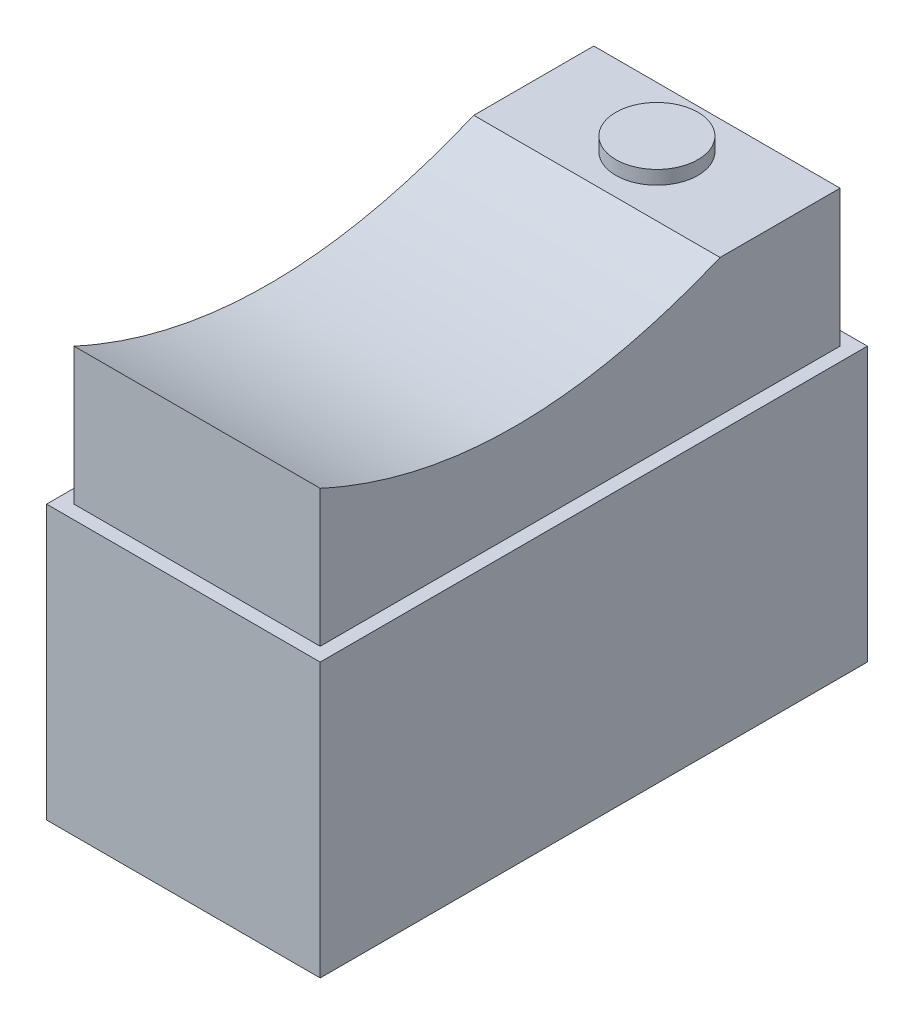
ISO-10303-21;
HEADER;
FILE_DESCRIPTION(('STEP AP214'),'2;1');
FILE_NAME('part.step','',(''),(''),'','','');
FILE_SCHEMA(('AUTOMOTIVE_DESIGN { 1 0 10303 214 1 1 1 1 }'));
ENDSEC;
DATA;
#1=APPLICATION_CONTEXT('core data for automotive mechanical design processes');
#2=APPLICATION_PROTOCOL_DEFINITION('international standard','automotive_design',2000,#1);
#3=PRODUCT_CONTEXT('',#1,'mechanical');
#4=PRODUCT('Part','Part','',(#3));
#5=PRODUCT_RELATED_PRODUCT_CATEGORY('part','',(#4));
#6=PRODUCT_DEFINITION_FORMATION('','',#4);
#7=PRODUCT_DEFINITION_CONTEXT('part definition',#1,'design');
#8=PRODUCT_DEFINITION('design','',#6,#7);
#9=PRODUCT_DEFINITION_SHAPE('','',#8);
#10=(LENGTH_UNIT() NAMED_UNIT(*) SI_UNIT(.MILLI.,.METRE.));
#11=(NAMED_UNIT(*) PLANE_ANGLE_UNIT() SI_UNIT($,.RADIAN.));
#12=(NAMED_UNIT(*) SI_UNIT($,.STERADIAN.) SOLID_ANGLE_UNIT());
#13=UNCERTAINTY_MEASURE_WITH_UNIT(LENGTH_MEASURE(1.E-05),#10,'distance_accuracy_value','');
#14=(GEOMETRIC_REPRESENTATION_CONTEXT(3) GLOBAL_UNCERTAINTY_ASSIGNED_CONTEXT((#13)) GLOBAL_UNIT_ASSIGNED_CONTEXT((#10,
#11,#12)) REPRESENTATION_CONTEXT('',''));
#15=CARTESIAN_POINT('',(0.,0.,0.));
#16=DIRECTION('',(0.,0.,1.));
#17=DIRECTION('',(1.,0.,0.));
#18=AXIS2_PLACEMENT_3D('',#15,#16,#17);
#19=CARTESIAN_POINT('',(0.,30.,0.));
#20=DIRECTION('',(0.,-1.,0.));
#21=DIRECTION('',(0.,0.,-1.));
#22=AXIS2_PLACEMENT_3D('',#19,#20,#21);
#23=PLANE('',#22);
#24=DIRECTION('',(1.,0.,0.));
#25=VECTOR('',#24,1.);
#26=CARTESIAN_POINT('',(-100.064560089181,30.,-10.2263908022718));
#27=LINE('',#26,#25);
#28=CARTESIAN_POINT('',(9.,30.,-10.2263908022718));
#29=VERTEX_POINT('',#28);
#30=CARTESIAN_POINT('',(-9.,30.,-10.2263908022718));
#31=VERTEX_POINT('',#30);
#32=EDGE_CURVE('E41',#29,#31,#27,.F.);
#33=ORIENTED_EDGE('',*,*,#32,.F.);
#34=DIRECTION('',(0.,0.,-1.));
#35=VECTOR('',#34,1.);
#36=CARTESIAN_POINT('',(9.,30.,19.));
#37=LINE('',#36,#35);
#38=CARTESIAN_POINT('',(9.,30.,-19.));
#39=VERTEX_POINT('',#38);
#40=EDGE_CURVE('E120',#29,#39,#37,.T.);
#41=ORIENTED_EDGE('',*,*,#40,.T.);
#42=DIRECTION('',(-1.,0.,0.));
#43=VECTOR('',#42,1.);
#44=CARTESIAN_POINT('',(-9.,30.,-19.));
#45=LINE('',#44,#43);
#46=CARTESIAN_POINT('',(-9.,30.,-19.));
#47=VERTEX_POINT('',#46);
#48=EDGE_CURVE('E129',#39,#47,#45,.T.);
#49=ORIENTED_EDGE('',*,*,#48,.T.);
#50=DIRECTION('',(0.,0.,1.));
#51=VECTOR('',#50,1.);
#52=CARTESIAN_POINT('',(-9.,30.,19.));
#53=LINE('',#52,#51);
#54=EDGE_CURVE('E125',#47,#31,#53,.T.);
#55=ORIENTED_EDGE('',*,*,#54,.T.);
#56=EDGE_LOOP('',(#33,#41,#49,#55));
#57=FACE_BOUND('',#56,.T.);
#58=CARTESIAN_POINT('',(0.,30.,-14.6131954011359));
#59=DIRECTION('',(0.,-1.,0.));
#60=DIRECTION('',(0.,0.,-1.));
#61=AXIS2_PLACEMENT_3D('',#58,#59,#60);
#62=CIRCLE('',#61,3.);
#63=CARTESIAN_POINT('',(0.,30.,-17.6131954011359));
#64=VERTEX_POINT('',#63);
#65=EDGE_CURVE('E11',#64,#64,#62,.F.);
#66=ORIENTED_EDGE('',*,*,#65,.F.);
#67=EDGE_LOOP('',(#66));
#68=FACE_BOUND('',#67,.T.);
#69=ADVANCED_FACE('F33',(#57,#68),#23,.F.);
#70=CARTESIAN_POINT('',(9.,20.,19.));
#71=DIRECTION('',(1.,0.,0.));
#72=DIRECTION('',(0.,0.,-1.));
#73=AXIS2_PLACEMENT_3D('',#70,#71,#72);
#74=PLANE('',#73);
#75=ORIENTED_EDGE('',*,*,#40,.F.);
#76=CARTESIAN_POINT('',(8.99999999999999,30.,-10.2263908022718));
#77=CARTESIAN_POINT('',(8.99999999999999,23.5924007474875,5.11136514016385));
#78=CARTESIAN_POINT('',(8.99999999999999,30.,19.));
#79=B_SPLINE_CURVE_WITH_KNOTS('',2,(#76,#77,#78),.UNSPECIFIED.,.F.,.F.,(3,3),(0.,1.),.UNSPECIFIED.);
#80=CARTESIAN_POINT('',(8.99999999999999,30.,19.));
#81=VERTEX_POINT('',#80);
#82=EDGE_CURVE('E117',#29,#81,#79,.T.);
#83=ORIENTED_EDGE('',*,*,#82,.T.);
#84=DIRECTION('',(0.,1.,0.));
#85=VECTOR('',#84,1.);
#86=CARTESIAN_POINT('',(9.,20.,19.));
#87=LINE('',#86,#85);
#88=CARTESIAN_POINT('',(9.,20.,19.));
#89=VERTEX_POINT('',#88);
#90=EDGE_CURVE('E103',#89,#81,#87,.T.);
#91=ORIENTED_EDGE('',*,*,#90,.F.);
#92=DIRECTION('',(0.,0.,-1.));
#93=VECTOR('',#92,1.);
#94=CARTESIAN_POINT('',(9.,20.,19.));
#95=LINE('',#94,#93);
#96=CARTESIAN_POINT('',(9.,20.,-19.));
#97=VERTEX_POINT('',#96);
#98=EDGE_CURVE('E124',#89,#97,#95,.T.);
#99=ORIENTED_EDGE('',*,*,#98,.T.);
#100=DIRECTION('',(0.,1.,0.));
#101=VECTOR('',#100,1.);
#102=CARTESIAN_POINT('',(9.,20.,-19.));
#103=LINE('',#102,#101);
#104=EDGE_CURVE('E137',#97,#39,#103,.T.);
#105=ORIENTED_EDGE('',*,*,#104,.T.);
#106=EDGE_LOOP('',(#75,#83,#91,#99,#105));
#107=FACE_BOUND('',#106,.T.);
#108=ADVANCED_FACE('F118',(#107),#74,.T.);
#109=CARTESIAN_POINT('',(-9.,20.,19.));
#110=DIRECTION('',(-1.,0.,0.));
#111=DIRECTION('',(0.,0.,1.));
#112=AXIS2_PLACEMENT_3D('',#109,#110,#111);
#113=PLANE('',#112);
#114=DIRECTION('',(0.,1.,0.));
#115=VECTOR('',#114,1.);
#116=CARTESIAN_POINT('',(-9.,20.,19.));
#117=LINE('',#116,#115);
#118=CARTESIAN_POINT('',(-9.,20.,19.));
#119=VERTEX_POINT('',#118);
#120=CARTESIAN_POINT('',(-9.,30.,19.));
#121=VERTEX_POINT('',#120);
#122=EDGE_CURVE('E114',#119,#121,#117,.T.);
#123=ORIENTED_EDGE('',*,*,#122,.T.);
#124=CARTESIAN_POINT('',(-9.00000000000001,30.,-10.2263908022718));
#125=CARTESIAN_POINT('',(-9.00000000000001,23.5924007474875,5.11136514016385));
#126=CARTESIAN_POINT('',(-9.00000000000001,30.,19.));
#127=B_SPLINE_CURVE_WITH_KNOTS('',2,(#124,#125,#126),.UNSPECIFIED.,.F.,.F.,(3,3),(0.,1.),.UNSPECIFIED.);
#128=EDGE_CURVE('E48',#121,#31,#127,.F.);
#129=ORIENTED_EDGE('',*,*,#128,.T.);
#130=ORIENTED_EDGE('',*,*,#54,.F.);
#131=DIRECTION('',(0.,1.,0.));
#132=VECTOR('',#131,1.);
#133=CARTESIAN_POINT('',(-9.,20.,-19.));
#134=LINE('',#133,#132);
#135=CARTESIAN_POINT('',(-9.,20.,-19.));
#136=VERTEX_POINT('',#135);
#137=EDGE_CURVE('E134',#136,#47,#134,.T.);
#138=ORIENTED_EDGE('',*,*,#137,.F.);
#139=DIRECTION('',(0.,0.,1.));
#140=VECTOR('',#139,1.);
#141=CARTESIAN_POINT('',(-9.,20.,19.));
#142=LINE('',#141,#140);
#143=EDGE_CURVE('E236',#136,#119,#142,.T.);
#144=ORIENTED_EDGE('',*,*,#143,.T.);
#145=EDGE_LOOP('',(#123,#129,#130,#138,#144));
#146=FACE_BOUND('',#145,.T.);
#147=ADVANCED_FACE('F204',(#146),#113,.T.);
#148=CARTESIAN_POINT('',(10.,30.,20.));
#149=DIRECTION('',(-1.,0.,0.));
#150=DIRECTION('',(0.,0.,1.));
#151=AXIS2_PLACEMENT_3D('',#148,#149,#150);
#152=PLANE('',#151);
#153=DIRECTION('',(0.,-1.,0.));
#154=VECTOR('',#153,1.);
#155=CARTESIAN_POINT('',(10.,30.,-20.));
#156=LINE('',#155,#154);
#157=CARTESIAN_POINT('',(10.,20.,-20.));
#158=VERTEX_POINT('',#157);
#159=CARTESIAN_POINT('',(10.,0.,-20.));
#160=VERTEX_POINT('',#159);
#161=EDGE_CURVE('E164',#158,#160,#156,.T.);
#162=ORIENTED_EDGE('',*,*,#161,.F.);
#163=DIRECTION('',(0.,0.,-1.));
#164=VECTOR('',#163,1.);
#165=CARTESIAN_POINT('',(10.,20.,20.));
#166=LINE('',#165,#164);
#167=CARTESIAN_POINT('',(10.,20.,20.));
#168=VERTEX_POINT('',#167);
#169=EDGE_CURVE('E113',#168,#158,#166,.T.);
#170=ORIENTED_EDGE('',*,*,#169,.F.);
#171=DIRECTION('',(0.,-1.,0.));
#172=VECTOR('',#171,1.);
#173=CARTESIAN_POINT('',(10.,30.,20.));
#174=LINE('',#173,#172);
#175=CARTESIAN_POINT('',(10.,0.,20.));
#176=VERTEX_POINT('',#175);
#177=EDGE_CURVE('E158',#168,#176,#174,.T.);
#178=ORIENTED_EDGE('',*,*,#177,.T.);
#179=DIRECTION('',(0.,0.,-1.));
#180=VECTOR('',#179,1.);
#181=CARTESIAN_POINT('',(10.,0.,20.));
#182=LINE('',#181,#180);
#183=EDGE_CURVE('E146',#176,#160,#182,.T.);
#184=ORIENTED_EDGE('',*,*,#183,.T.);
#185=EDGE_LOOP('',(#162,#170,#178,#184));
#186=FACE_BOUND('',#185,.T.);
#187=ADVANCED_FACE('F35',(#186),#152,.F.);
#188=CARTESIAN_POINT('',(-10.,30.,-20.));
#189=DIRECTION('',(0.,0.,1.));
#190=DIRECTION('',(1.,0.,0.));
#191=AXIS2_PLACEMENT_3D('',#188,#189,#190);
#192=PLANE('',#191);
#193=DIRECTION('',(0.,-1.,0.));
#194=VECTOR('',#193,1.);
#195=CARTESIAN_POINT('',(-10.,30.,-20.));
#196=LINE('',#195,#194);
#197=CARTESIAN_POINT('',(-10.,20.,-20.));
#198=VERTEX_POINT('',#197);
#199=CARTESIAN_POINT('',(-10.,0.,-20.));
#200=VERTEX_POINT('',#199);
#201=EDGE_CURVE('E162',#198,#200,#196,.T.);
#202=ORIENTED_EDGE('',*,*,#201,.F.);
#203=DIRECTION('',(-1.,0.,0.));
#204=VECTOR('',#203,1.);
#205=CARTESIAN_POINT('',(-10.,20.,-20.));
#206=LINE('',#205,#204);
#207=EDGE_CURVE('E140',#158,#198,#206,.T.);
#208=ORIENTED_EDGE('',*,*,#207,.F.);
#209=ORIENTED_EDGE('',*,*,#161,.T.);
#210=DIRECTION('',(-1.,0.,0.));
#211=VECTOR('',#210,1.);
#212=CARTESIAN_POINT('',(-10.,0.,-20.));
#213=LINE('',#212,#211);
#214=EDGE_CURVE('E149',#160,#200,#213,.T.);
#215=ORIENTED_EDGE('',*,*,#214,.T.);
#216=EDGE_LOOP('',(#202,#208,#209,#215));
#217=FACE_BOUND('',#216,.T.);
#218=ADVANCED_FACE('F170',(#217),#192,.F.);
#219=CARTESIAN_POINT('',(-10.,30.,20.));
#220=DIRECTION('',(1.,0.,0.));
#221=DIRECTION('',(0.,0.,-1.));
#222=AXIS2_PLACEMENT_3D('',#219,#220,#221);
#223=PLANE('',#222);
#224=DIRECTION('',(0.,-1.,0.));
#225=VECTOR('',#224,1.);
#226=CARTESIAN_POINT('',(-10.,30.,20.));
#227=LINE('',#226,#225);
#228=CARTESIAN_POINT('',(-10.,20.,20.));
#229=VERTEX_POINT('',#228);
#230=CARTESIAN_POINT('',(-10.,0.,20.));
#231=VERTEX_POINT('',#230);
#232=EDGE_CURVE('E160',#229,#231,#227,.T.);
#233=ORIENTED_EDGE('',*,*,#232,.F.);
#234=DIRECTION('',(0.,0.,1.));
#235=VECTOR('',#234,1.);
#236=CARTESIAN_POINT('',(-10.,20.,20.));
#237=LINE('',#236,#235);
#238=EDGE_CURVE('E142',#198,#229,#237,.T.);
#239=ORIENTED_EDGE('',*,*,#238,.F.);
#240=ORIENTED_EDGE('',*,*,#201,.T.);
#241=DIRECTION('',(0.,0.,1.));
#242=VECTOR('',#241,1.);
#243=CARTESIAN_POINT('',(-10.,0.,20.));
#244=LINE('',#243,#242);
#245=EDGE_CURVE('E152',#200,#231,#244,.T.);
#246=ORIENTED_EDGE('',*,*,#245,.T.);
#247=EDGE_LOOP('',(#233,#239,#240,#246));
#248=FACE_BOUND('',#247,.T.);
#249=ADVANCED_FACE('F185',(#248),#223,.F.);
#250=CARTESIAN_POINT('',(-10.,30.,20.));
#251=DIRECTION('',(0.,0.,-1.));
#252=DIRECTION('',(-1.,0.,0.));
#253=AXIS2_PLACEMENT_3D('',#250,#251,#252);
#254=PLANE('',#253);
#255=ORIENTED_EDGE('',*,*,#177,.F.);
#256=DIRECTION('',(1.,0.,0.));
#257=VECTOR('',#256,1.);
#258=CARTESIAN_POINT('',(-10.,20.,20.));
#259=LINE('',#258,#257);
#260=EDGE_CURVE('E144',#229,#168,#259,.T.);
#261=ORIENTED_EDGE('',*,*,#260,.F.);
#262=ORIENTED_EDGE('',*,*,#232,.T.);
#263=DIRECTION('',(1.,0.,0.));
#264=VECTOR('',#263,1.);
#265=CARTESIAN_POINT('',(-10.,0.,20.));
#266=LINE('',#265,#264);
#267=EDGE_CURVE('E155',#231,#176,#266,.T.);
#268=ORIENTED_EDGE('',*,*,#267,.T.);
#269=EDGE_LOOP('',(#255,#261,#262,#268));
#270=FACE_BOUND('',#269,.T.);
#271=ADVANCED_FACE('F181',(#270),#254,.F.);
#272=CARTESIAN_POINT('',(0.,0.,0.));
#273=DIRECTION('',(0.,-1.,0.));
#274=DIRECTION('',(0.,0.,-1.));
#275=AXIS2_PLACEMENT_3D('',#272,#273,#274);
#276=PLANE('',#275);
#277=ORIENTED_EDGE('',*,*,#183,.F.);
#278=ORIENTED_EDGE('',*,*,#267,.F.);
#279=ORIENTED_EDGE('',*,*,#245,.F.);
#280=ORIENTED_EDGE('',*,*,#214,.F.);
#281=EDGE_LOOP('',(#277,#278,#279,#280));
#282=FACE_BOUND('',#281,.T.);
#283=ADVANCED_FACE('F176',(#282),#276,.T.);
#284=CARTESIAN_POINT('',(0.,20.,0.));
#285=DIRECTION('',(0.,-1.,0.));
#286=DIRECTION('',(0.,0.,-1.));
#287=AXIS2_PLACEMENT_3D('',#284,#285,#286);
#288=PLANE('',#287);
#289=ORIENTED_EDGE('',*,*,#98,.F.);
#290=DIRECTION('',(1.,0.,0.));
#291=VECTOR('',#290,1.);
#292=CARTESIAN_POINT('',(-9.,20.,19.));
#293=LINE('',#292,#291);
#294=EDGE_CURVE('E109',#119,#89,#293,.T.);
#295=ORIENTED_EDGE('',*,*,#294,.F.);
#296=ORIENTED_EDGE('',*,*,#143,.F.);
#297=DIRECTION('',(-1.,0.,0.));
#298=VECTOR('',#297,1.);
#299=CARTESIAN_POINT('',(-9.,20.,-19.));
#300=LINE('',#299,#298);
#301=EDGE_CURVE('E127',#97,#136,#300,.T.);
#302=ORIENTED_EDGE('',*,*,#301,.F.);
#303=EDGE_LOOP('',(#289,#295,#296,#302));
#304=FACE_BOUND('',#303,.T.);
#305=ORIENTED_EDGE('',*,*,#169,.T.);
#306=ORIENTED_EDGE('',*,*,#207,.T.);
#307=ORIENTED_EDGE('',*,*,#238,.T.);
#308=ORIENTED_EDGE('',*,*,#260,.T.);
#309=EDGE_LOOP('',(#305,#306,#307,#308));
#310=FACE_BOUND('',#309,.T.);
#311=ADVANCED_FACE('F187',(#304,#310),#288,.F.);
#312=CARTESIAN_POINT('',(-9.,20.,19.));
#313=DIRECTION('',(0.,0.,1.));
#314=DIRECTION('',(1.,0.,0.));
#315=AXIS2_PLACEMENT_3D('',#312,#313,#314);
#316=PLANE('',#315);
#317=DIRECTION('',(1.,0.,0.));
#318=VECTOR('',#317,1.);
#319=CARTESIAN_POINT('',(-9.,30.,19.));
#320=LINE('',#319,#318);
#321=EDGE_CURVE('E107',#121,#81,#320,.T.);
#322=ORIENTED_EDGE('',*,*,#321,.F.);
#323=ORIENTED_EDGE('',*,*,#122,.F.);
#324=ORIENTED_EDGE('',*,*,#294,.T.);
#325=ORIENTED_EDGE('',*,*,#90,.T.);
#326=EDGE_LOOP('',(#322,#323,#324,#325));
#327=FACE_BOUND('',#326,.T.);
#328=ADVANCED_FACE('F105',(#327),#316,.T.);
#329=CARTESIAN_POINT('',(-9.,20.,-19.));
#330=DIRECTION('',(0.,0.,-1.));
#331=DIRECTION('',(-1.,0.,0.));
#332=AXIS2_PLACEMENT_3D('',#329,#330,#331);
#333=PLANE('',#332);
#334=ORIENTED_EDGE('',*,*,#48,.F.);
#335=ORIENTED_EDGE('',*,*,#104,.F.);
#336=ORIENTED_EDGE('',*,*,#301,.T.);
#337=ORIENTED_EDGE('',*,*,#137,.T.);
#338=EDGE_LOOP('',(#334,#335,#336,#337));
#339=FACE_BOUND('',#338,.T.);
#340=ADVANCED_FACE('F195',(#339),#333,.T.);
#341=CARTESIAN_POINT('',(-100.064560089181,30.,-10.2263908022718));
#342=CARTESIAN_POINT('',(-100.064560089181,23.5924007474875,5.11136514016385));
#343=CARTESIAN_POINT('',(-100.064560089181,30.,19.));
#344=B_SPLINE_CURVE_WITH_KNOTS('',2,(#341,#342,#343),.UNSPECIFIED.,.F.,.F.,(3,3),(0.,1.),.UNSPECIFIED.);
#345=DIRECTION('',(1.,0.,0.));
#346=VECTOR('',#345,1.);
#347=SURFACE_OF_LINEAR_EXTRUSION('',#344,#346);
#348=ORIENTED_EDGE('',*,*,#82,.F.);
#349=ORIENTED_EDGE('',*,*,#32,.T.);
#350=ORIENTED_EDGE('',*,*,#128,.F.);
#351=ORIENTED_EDGE('',*,*,#321,.T.);
#352=EDGE_LOOP('',(#348,#349,#350,#351));
#353=FACE_BOUND('',#352,.T.);
#354=ADVANCED_FACE('F123',(#353),#347,.T.);
#355=CARTESIAN_POINT('',(0.,31.,-14.6131954011359));
#356=DIRECTION('',(0.,-1.,0.));
#357=DIRECTION('',(0.,0.,-1.));
#358=AXIS2_PLACEMENT_3D('',#355,#356,#357);
#359=CYLINDRICAL_SURFACE('',#358,3.);
#360=CARTESIAN_POINT('',(0.,31.,-14.6131954011359));
#361=DIRECTION('',(0.,1.,0.));
#362=DIRECTION('',(0.,0.,1.));
#363=AXIS2_PLACEMENT_3D('',#360,#361,#362);
#364=CIRCLE('',#363,3.);
#365=CARTESIAN_POINT('',(0.,31.,-11.6131954011359));
#366=VERTEX_POINT('',#365);
#367=EDGE_CURVE('E248',#366,#366,#364,.T.);
#368=ORIENTED_EDGE('',*,*,#367,.F.);
#369=EDGE_LOOP('',(#368));
#370=FACE_BOUND('',#369,.T.);
#371=ORIENTED_EDGE('',*,*,#65,.T.);
#372=EDGE_LOOP('',(#371));
#373=FACE_BOUND('',#372,.T.);
#374=ADVANCED_FACE('F227',(#370,#373),#359,.T.);
#375=CARTESIAN_POINT('',(0.,31.,-14.6131954011359));
#376=DIRECTION('',(0.,1.,0.));
#377=DIRECTION('',(0.,0.,1.));
#378=AXIS2_PLACEMENT_3D('',#375,#376,#377);
#379=PLANE('',#378);
#380=ORIENTED_EDGE('',*,*,#367,.T.);
#381=EDGE_LOOP('',(#380));
#382=FACE_BOUND('',#381,.T.);
#383=ADVANCED_FACE('F262',(#382),#379,.T.);
#384=CLOSED_SHELL('',(#69,#108,#147,#187,#218,#249,#271,#283,#311,#328,#340,#354,#374,#383));
#385=MANIFOLD_SOLID_BREP('B2',#384);
#386=ADVANCED_BREP_SHAPE_REPRESENTATION('',(#18,#385),#14);
#387=SHAPE_DEFINITION_REPRESENTATION(#9,#386);
ENDSEC;
END-ISO-10303-21;
